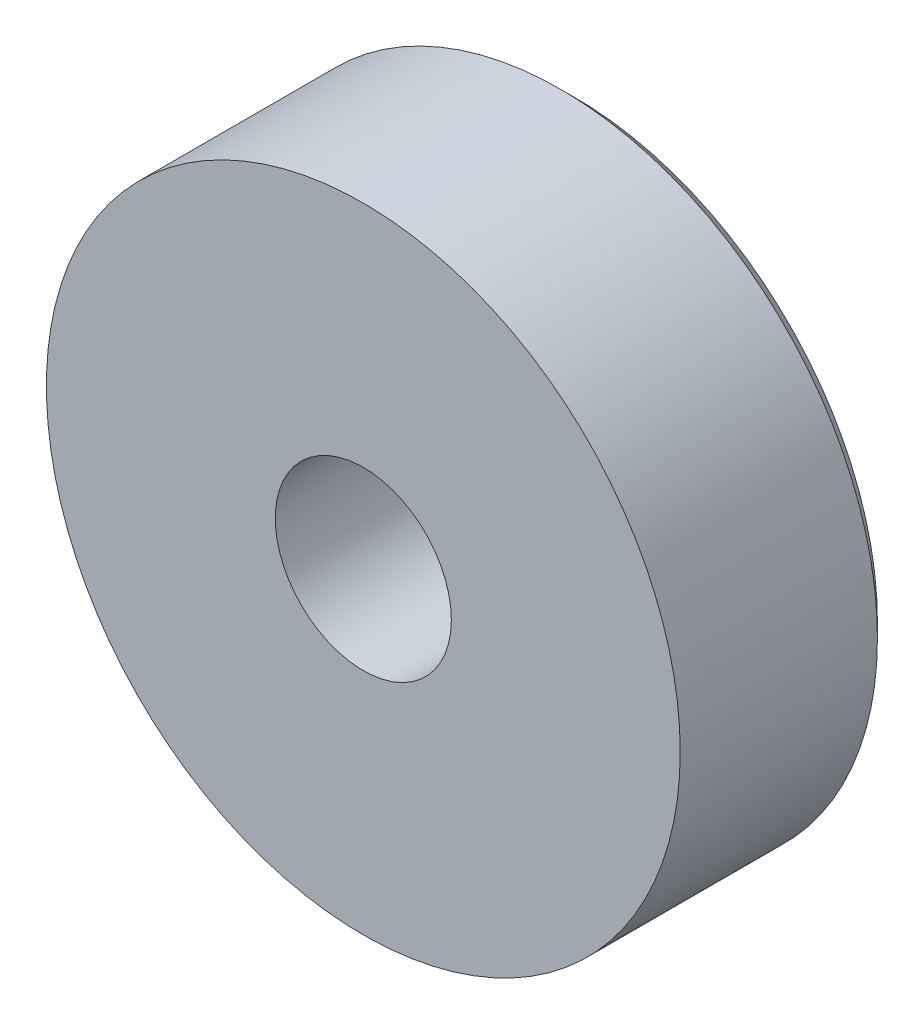
ISO-10303-21;
HEADER;
FILE_DESCRIPTION(('STEP AP214'),'2;1');
FILE_NAME('part.step','',(''),(''),'','','');
FILE_SCHEMA(('AUTOMOTIVE_DESIGN { 1 0 10303 214 1 1 1 1 }'));
ENDSEC;
DATA;
#1=APPLICATION_CONTEXT('core data for automotive mechanical design processes');
#2=APPLICATION_PROTOCOL_DEFINITION('international standard','automotive_design',2000,#1);
#3=PRODUCT_CONTEXT('',#1,'mechanical');
#4=PRODUCT('Part','Part','',(#3));
#5=PRODUCT_RELATED_PRODUCT_CATEGORY('part','',(#4));
#6=PRODUCT_DEFINITION_FORMATION('','',#4);
#7=PRODUCT_DEFINITION_CONTEXT('part definition',#1,'design');
#8=PRODUCT_DEFINITION('design','',#6,#7);
#9=PRODUCT_DEFINITION_SHAPE('','',#8);
#10=(LENGTH_UNIT() NAMED_UNIT(*) SI_UNIT(.MILLI.,.METRE.));
#11=(NAMED_UNIT(*) PLANE_ANGLE_UNIT() SI_UNIT($,.RADIAN.));
#12=(NAMED_UNIT(*) SI_UNIT($,.STERADIAN.) SOLID_ANGLE_UNIT());
#13=UNCERTAINTY_MEASURE_WITH_UNIT(LENGTH_MEASURE(1.E-05),#10,'distance_accuracy_value','');
#14=(GEOMETRIC_REPRESENTATION_CONTEXT(3) GLOBAL_UNCERTAINTY_ASSIGNED_CONTEXT((#13)) GLOBAL_UNIT_ASSIGNED_CONTEXT((#10,
#11,#12)) REPRESENTATION_CONTEXT('',''));
#15=CARTESIAN_POINT('',(0.,0.,0.));
#16=DIRECTION('',(0.,0.,1.));
#17=DIRECTION('',(1.,0.,0.));
#18=AXIS2_PLACEMENT_3D('',#15,#16,#17);
#19=CARTESIAN_POINT('',(0.,0.,-16.9999938838146));
#20=DIRECTION('',(0.,0.,-1.));
#21=DIRECTION('',(-1.,0.,0.));
#22=AXIS2_PLACEMENT_3D('',#19,#20,#21);
#23=CONICAL_SURFACE('',#22,1.44999999986339,0.785398163397448);
#24=CARTESIAN_POINT('',(0.,0.,-16.799993883903));
#25=DIRECTION('',(0.,0.,1.));
#26=DIRECTION('',(1.,0.,0.));
#27=AXIS2_PLACEMENT_3D('',#24,#25,#26);
#28=CIRCLE('',#27,1.25);
#29=CARTESIAN_POINT('',(1.25,0.,-16.799993883903));
#30=VERTEX_POINT('',#29);
#31=EDGE_CURVE('E30',#30,#30,#28,.T.);
#32=ORIENTED_EDGE('',*,*,#31,.T.);
#33=EDGE_LOOP('',(#32));
#34=FACE_BOUND('',#33,.T.);
#35=CARTESIAN_POINT('',(0.,0.,-16.9999938839283));
#36=DIRECTION('',(0.,0.,-1.));
#37=DIRECTION('',(-1.,0.,0.));
#38=AXIS2_PLACEMENT_3D('',#35,#36,#37);
#39=CIRCLE('',#38,1.44999999997708);
#40=CARTESIAN_POINT('',(-1.44999999997708,0.,-16.9999938839283));
#41=VERTEX_POINT('',#40);
#42=EDGE_CURVE('E18',#41,#41,#39,.F.);
#43=ORIENTED_EDGE('',*,*,#42,.F.);
#44=EDGE_LOOP('',(#43));
#45=FACE_BOUND('',#44,.T.);
#46=ADVANCED_FACE('F15',(#34,#45),#23,.F.);
#47=CARTESIAN_POINT('',(0.,0.,-16.999993883903));
#48=DIRECTION('',(0.,0.,1.));
#49=DIRECTION('',(1.,0.,0.));
#50=AXIS2_PLACEMENT_3D('',#47,#48,#49);
#51=CYLINDRICAL_SURFACE('',#50,1.25);
#52=ORIENTED_EDGE('',*,*,#31,.F.);
#53=EDGE_LOOP('',(#52));
#54=FACE_BOUND('',#53,.T.);
#55=CARTESIAN_POINT('',(0.,0.,-13.999993883903));
#56=DIRECTION('',(0.,0.,1.));
#57=DIRECTION('',(1.,0.,0.));
#58=AXIS2_PLACEMENT_3D('',#55,#56,#57);
#59=CIRCLE('',#58,1.25);
#60=CARTESIAN_POINT('',(1.25,0.,-13.999993883903));
#61=VERTEX_POINT('',#60);
#62=EDGE_CURVE('E34',#61,#61,#59,.T.);
#63=ORIENTED_EDGE('',*,*,#62,.T.);
#64=EDGE_LOOP('',(#63));
#65=FACE_BOUND('',#64,.T.);
#66=ADVANCED_FACE('F45',(#54,#65),#51,.F.);
#67=CARTESIAN_POINT('',(0.,0.,-16.999993883903));
#68=DIRECTION('',(0.,0.,-1.));
#69=DIRECTION('',(-1.,0.,0.));
#70=AXIS2_PLACEMENT_3D('',#67,#68,#69);
#71=PLANE('',#70);
#72=ORIENTED_EDGE('',*,*,#42,.T.);
#73=EDGE_LOOP('',(#72));
#74=FACE_BOUND('',#73,.T.);
#75=CARTESIAN_POINT('',(0.,0.,-16.9999938838714));
#76=DIRECTION('',(0.,0.,1.));
#77=DIRECTION('',(1.,0.,0.));
#78=AXIS2_PLACEMENT_3D('',#75,#76,#77);
#79=CIRCLE('',#78,4.30000000000064);
#80=CARTESIAN_POINT('',(4.30000000000064,0.,-16.9999938838714));
#81=VERTEX_POINT('',#80);
#82=EDGE_CURVE('E27',#81,#81,#79,.T.);
#83=ORIENTED_EDGE('',*,*,#82,.F.);
#84=EDGE_LOOP('',(#83));
#85=FACE_BOUND('',#84,.T.);
#86=ADVANCED_FACE('F41',(#74,#85),#71,.T.);
#87=CARTESIAN_POINT('',(0.,0.,-13.999993883903));
#88=DIRECTION('',(0.,0.,-1.));
#89=DIRECTION('',(-1.,0.,0.));
#90=AXIS2_PLACEMENT_3D('',#87,#88,#89);
#91=PLANE('',#90);
#92=ORIENTED_EDGE('',*,*,#62,.F.);
#93=EDGE_LOOP('',(#92));
#94=FACE_BOUND('',#93,.T.);
#95=CARTESIAN_POINT('',(0.,0.,-13.999993883903));
#96=DIRECTION('',(0.,0.,1.));
#97=DIRECTION('',(1.,0.,0.));
#98=AXIS2_PLACEMENT_3D('',#95,#96,#97);
#99=CIRCLE('',#98,4.5);
#100=CARTESIAN_POINT('',(4.5,0.,-13.999993883903));
#101=VERTEX_POINT('',#100);
#102=EDGE_CURVE('E22',#101,#101,#99,.F.);
#103=ORIENTED_EDGE('',*,*,#102,.F.);
#104=EDGE_LOOP('',(#103));
#105=FACE_BOUND('',#104,.T.);
#106=ADVANCED_FACE('F59',(#94,#105),#91,.F.);
#107=CARTESIAN_POINT('',(0.,0.,-16.7999938839785));
#108=DIRECTION('',(0.,0.,1.));
#109=DIRECTION('',(1.,0.,0.));
#110=AXIS2_PLACEMENT_3D('',#107,#108,#109);
#111=CONICAL_SURFACE('',#110,4.49999999983675,0.78539816325534);
#112=CARTESIAN_POINT('',(0.,0.,-16.799993883903));
#113=DIRECTION('',(0.,0.,1.));
#114=DIRECTION('',(1.,0.,0.));
#115=AXIS2_PLACEMENT_3D('',#112,#113,#114);
#116=CIRCLE('',#115,4.5);
#117=CARTESIAN_POINT('',(4.5,0.,-16.799993883903));
#118=VERTEX_POINT('',#117);
#119=EDGE_CURVE('E10',#118,#118,#116,.T.);
#120=ORIENTED_EDGE('',*,*,#119,.F.);
#121=EDGE_LOOP('',(#120));
#122=FACE_BOUND('',#121,.T.);
#123=ORIENTED_EDGE('',*,*,#82,.T.);
#124=EDGE_LOOP('',(#123));
#125=FACE_BOUND('',#124,.T.);
#126=ADVANCED_FACE('F54',(#122,#125),#111,.T.);
#127=CARTESIAN_POINT('',(0.,0.,-16.999993883903));
#128=DIRECTION('',(0.,0.,1.));
#129=DIRECTION('',(1.,0.,0.));
#130=AXIS2_PLACEMENT_3D('',#127,#128,#129);
#131=CYLINDRICAL_SURFACE('',#130,4.5);
#132=ORIENTED_EDGE('',*,*,#119,.T.);
#133=EDGE_LOOP('',(#132));
#134=FACE_BOUND('',#133,.T.);
#135=ORIENTED_EDGE('',*,*,#102,.T.);
#136=EDGE_LOOP('',(#135));
#137=FACE_BOUND('',#136,.T.);
#138=ADVANCED_FACE('F52',(#134,#137),#131,.T.);
#139=CLOSED_SHELL('',(#46,#66,#86,#106,#126,#138));
#140=MANIFOLD_SOLID_BREP('B1',#139);
#141=ADVANCED_BREP_SHAPE_REPRESENTATION('',(#18,#140),#14);
#142=SHAPE_DEFINITION_REPRESENTATION(#9,#141);
ENDSEC;
END-ISO-10303-21;
